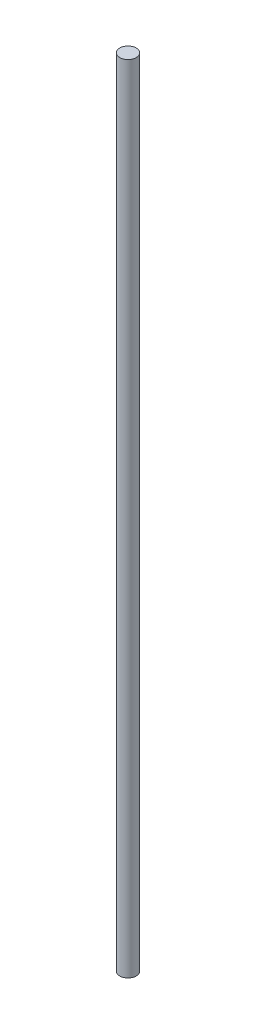
ISO-10303-21;
HEADER;
FILE_DESCRIPTION(('STEP AP214'),'2;1');
FILE_NAME('part.step','',(''),(''),'','','');
FILE_SCHEMA(('AUTOMOTIVE_DESIGN { 1 0 10303 214 1 1 1 1 }'));
ENDSEC;
DATA;
#1=APPLICATION_CONTEXT('core data for automotive mechanical design processes');
#2=APPLICATION_PROTOCOL_DEFINITION('international standard','automotive_design',2000,#1);
#3=PRODUCT_CONTEXT('',#1,'mechanical');
#4=PRODUCT('Part','Part','',(#3));
#5=PRODUCT_RELATED_PRODUCT_CATEGORY('part','',(#4));
#6=PRODUCT_DEFINITION_FORMATION('','',#4);
#7=PRODUCT_DEFINITION_CONTEXT('part definition',#1,'design');
#8=PRODUCT_DEFINITION('design','',#6,#7);
#9=PRODUCT_DEFINITION_SHAPE('','',#8);
#10=(LENGTH_UNIT() NAMED_UNIT(*) SI_UNIT(.MILLI.,.METRE.));
#11=(NAMED_UNIT(*) PLANE_ANGLE_UNIT() SI_UNIT($,.RADIAN.));
#12=(NAMED_UNIT(*) SI_UNIT($,.STERADIAN.) SOLID_ANGLE_UNIT());
#13=UNCERTAINTY_MEASURE_WITH_UNIT(LENGTH_MEASURE(1.E-05),#10,'distance_accuracy_value','');
#14=(GEOMETRIC_REPRESENTATION_CONTEXT(3) GLOBAL_UNCERTAINTY_ASSIGNED_CONTEXT((#13)) GLOBAL_UNIT_ASSIGNED_CONTEXT((#10,
#11,#12)) REPRESENTATION_CONTEXT('',''));
#15=CARTESIAN_POINT('',(0.,0.,0.));
#16=DIRECTION('',(0.,0.,1.));
#17=DIRECTION('',(1.,0.,0.));
#18=AXIS2_PLACEMENT_3D('',#15,#16,#17);
#19=CARTESIAN_POINT('',(0.,914.4,0.));
#20=DIRECTION('',(0.,-1.,0.));
#21=DIRECTION('',(0.,0.,-1.));
#22=AXIS2_PLACEMENT_3D('',#19,#20,#21);
#23=CYLINDRICAL_SURFACE('',#22,9.525);
#24=CARTESIAN_POINT('',(0.,914.4,0.));
#25=DIRECTION('',(0.,1.,0.));
#26=DIRECTION('',(0.,0.,1.));
#27=AXIS2_PLACEMENT_3D('',#24,#25,#26);
#28=CIRCLE('',#27,9.525);
#29=CARTESIAN_POINT('',(0.,914.4,9.525));
#30=VERTEX_POINT('',#29);
#31=EDGE_CURVE('E10',#30,#30,#28,.T.);
#32=ORIENTED_EDGE('',*,*,#31,.F.);
#33=EDGE_LOOP('',(#32));
#34=FACE_BOUND('',#33,.T.);
#35=CARTESIAN_POINT('',(0.,0.,0.));
#36=DIRECTION('',(0.,1.,0.));
#37=DIRECTION('',(0.,0.,1.));
#38=AXIS2_PLACEMENT_3D('',#35,#36,#37);
#39=CIRCLE('',#38,9.525);
#40=CARTESIAN_POINT('',(0.,0.,9.525));
#41=VERTEX_POINT('',#40);
#42=EDGE_CURVE('E35',#41,#41,#39,.T.);
#43=ORIENTED_EDGE('',*,*,#42,.T.);
#44=EDGE_LOOP('',(#43));
#45=FACE_BOUND('',#44,.T.);
#46=ADVANCED_FACE('F32',(#34,#45),#23,.T.);
#47=CARTESIAN_POINT('',(0.,914.4,0.));
#48=DIRECTION('',(0.,1.,0.));
#49=DIRECTION('',(0.,0.,1.));
#50=AXIS2_PLACEMENT_3D('',#47,#48,#49);
#51=PLANE('',#50);
#52=ORIENTED_EDGE('',*,*,#31,.T.);
#53=EDGE_LOOP('',(#52));
#54=FACE_BOUND('',#53,.T.);
#55=ADVANCED_FACE('F47',(#54),#51,.T.);
#56=CARTESIAN_POINT('',(0.,0.,0.));
#57=DIRECTION('',(0.,1.,0.));
#58=DIRECTION('',(0.,0.,1.));
#59=AXIS2_PLACEMENT_3D('',#56,#57,#58);
#60=PLANE('',#59);
#61=ORIENTED_EDGE('',*,*,#42,.F.);
#62=EDGE_LOOP('',(#61));
#63=FACE_BOUND('',#62,.T.);
#64=ADVANCED_FACE('F45',(#63),#60,.F.);
#65=CLOSED_SHELL('',(#46,#55,#64));
#66=MANIFOLD_SOLID_BREP('B2',#65);
#67=ADVANCED_BREP_SHAPE_REPRESENTATION('',(#18,#66),#14);
#68=SHAPE_DEFINITION_REPRESENTATION(#9,#67);
ENDSEC;
END-ISO-10303-21;
